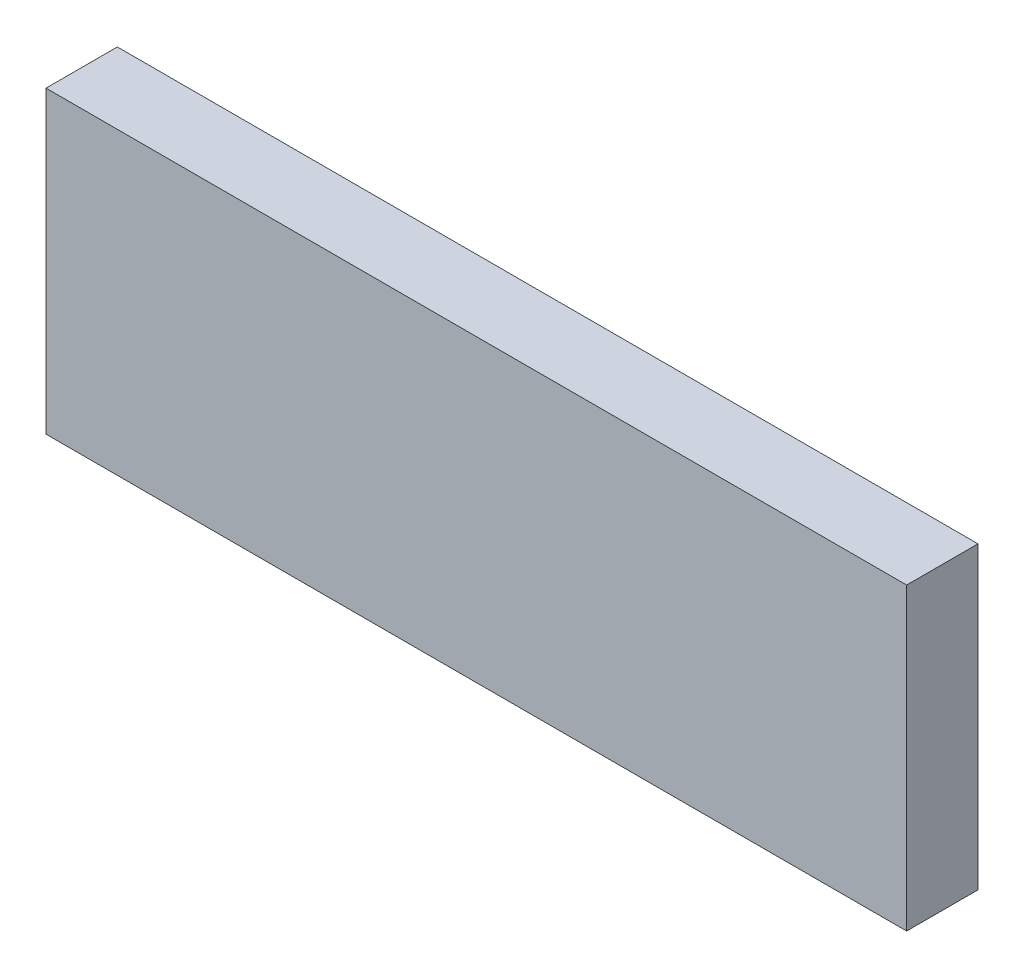
ISO-10303-21;
HEADER;
FILE_DESCRIPTION(('STEP AP214'),'2;1');
FILE_NAME('part.step','',(''),(''),'','','');
FILE_SCHEMA(('AUTOMOTIVE_DESIGN { 1 0 10303 214 1 1 1 1 }'));
ENDSEC;
DATA;
#1=APPLICATION_CONTEXT('core data for automotive mechanical design processes');
#2=APPLICATION_PROTOCOL_DEFINITION('international standard','automotive_design',2000,#1);
#3=PRODUCT_CONTEXT('',#1,'mechanical');
#4=PRODUCT('Part','Part','',(#3));
#5=PRODUCT_RELATED_PRODUCT_CATEGORY('part','',(#4));
#6=PRODUCT_DEFINITION_FORMATION('','',#4);
#7=PRODUCT_DEFINITION_CONTEXT('part definition',#1,'design');
#8=PRODUCT_DEFINITION('design','',#6,#7);
#9=PRODUCT_DEFINITION_SHAPE('','',#8);
#10=(LENGTH_UNIT() NAMED_UNIT(*) SI_UNIT(.MILLI.,.METRE.));
#11=(NAMED_UNIT(*) PLANE_ANGLE_UNIT() SI_UNIT($,.RADIAN.));
#12=(NAMED_UNIT(*) SI_UNIT($,.STERADIAN.) SOLID_ANGLE_UNIT());
#13=UNCERTAINTY_MEASURE_WITH_UNIT(LENGTH_MEASURE(1.E-05),#10,'distance_accuracy_value','');
#14=(GEOMETRIC_REPRESENTATION_CONTEXT(3) GLOBAL_UNCERTAINTY_ASSIGNED_CONTEXT((#13)) GLOBAL_UNIT_ASSIGNED_CONTEXT((#10,
#11,#12)) REPRESENTATION_CONTEXT('',''));
#15=CARTESIAN_POINT('',(0.,0.,0.));
#16=DIRECTION('',(0.,0.,1.));
#17=DIRECTION('',(1.,0.,0.));
#18=AXIS2_PLACEMENT_3D('',#15,#16,#17);
#19=CARTESIAN_POINT('',(-2.4125,0.,0.2));
#20=DIRECTION('',(0.,0.,1.));
#21=DIRECTION('',(1.,0.,0.));
#22=AXIS2_PLACEMENT_3D('',#19,#20,#21);
#23=PLANE('',#22);
#24=DIRECTION('',(0.,1.,0.));
#25=VECTOR('',#24,1.);
#26=CARTESIAN_POINT('',(0.,0.,0.2));
#27=LINE('',#26,#25);
#28=CARTESIAN_POINT('',(0.,0.84,0.2));
#29=VERTEX_POINT('',#28);
#30=CARTESIAN_POINT('',(0.,0.,0.2));
#31=VERTEX_POINT('',#30);
#32=EDGE_CURVE('E76',#29,#31,#27,.F.);
#33=ORIENTED_EDGE('',*,*,#32,.F.);
#34=DIRECTION('',(1.,0.,0.));
#35=VECTOR('',#34,1.);
#36=CARTESIAN_POINT('',(-2.4125,0.84,0.2));
#37=LINE('',#36,#35);
#38=CARTESIAN_POINT('',(-2.4125,0.84,0.2));
#39=VERTEX_POINT('',#38);
#40=EDGE_CURVE('E58',#39,#29,#37,.T.);
#41=ORIENTED_EDGE('',*,*,#40,.F.);
#42=DIRECTION('',(0.,1.,0.));
#43=VECTOR('',#42,1.);
#44=CARTESIAN_POINT('',(-2.4125,0.,0.2));
#45=LINE('',#44,#43);
#46=CARTESIAN_POINT('',(-2.4125,0.,0.2));
#47=VERTEX_POINT('',#46);
#48=EDGE_CURVE('E20',#39,#47,#45,.F.);
#49=ORIENTED_EDGE('',*,*,#48,.T.);
#50=DIRECTION('',(1.,0.,0.));
#51=VECTOR('',#50,1.);
#52=CARTESIAN_POINT('',(-2.4125,0.,0.2));
#53=LINE('',#52,#51);
#54=EDGE_CURVE('E55',#47,#31,#53,.T.);
#55=ORIENTED_EDGE('',*,*,#54,.T.);
#56=EDGE_LOOP('',(#33,#41,#49,#55));
#57=FACE_BOUND('',#56,.T.);
#58=ADVANCED_FACE('F17',(#57),#23,.T.);
#59=CARTESIAN_POINT('',(-2.4125,0.,0.));
#60=DIRECTION('',(1.,0.,0.));
#61=DIRECTION('',(0.,0.,-1.));
#62=AXIS2_PLACEMENT_3D('',#59,#60,#61);
#63=PLANE('',#62);
#64=DIRECTION('',(0.,0.,1.));
#65=VECTOR('',#64,1.);
#66=CARTESIAN_POINT('',(-2.4125,0.84,0.));
#67=LINE('',#66,#65);
#68=CARTESIAN_POINT('',(-2.4125,0.84,0.));
#69=VERTEX_POINT('',#68);
#70=EDGE_CURVE('E78',#69,#39,#67,.T.);
#71=ORIENTED_EDGE('',*,*,#70,.F.);
#72=DIRECTION('',(0.,1.,0.));
#73=VECTOR('',#72,1.);
#74=CARTESIAN_POINT('',(-2.4125,0.,0.));
#75=LINE('',#74,#73);
#76=CARTESIAN_POINT('',(-2.4125,0.,0.));
#77=VERTEX_POINT('',#76);
#78=EDGE_CURVE('E73',#69,#77,#75,.F.);
#79=ORIENTED_EDGE('',*,*,#78,.T.);
#80=DIRECTION('',(0.,0.,1.));
#81=VECTOR('',#80,1.);
#82=CARTESIAN_POINT('',(-2.4125,0.,0.));
#83=LINE('',#82,#81);
#84=EDGE_CURVE('E63',#77,#47,#83,.T.);
#85=ORIENTED_EDGE('',*,*,#84,.T.);
#86=ORIENTED_EDGE('',*,*,#48,.F.);
#87=EDGE_LOOP('',(#71,#79,#85,#86));
#88=FACE_BOUND('',#87,.T.);
#89=ADVANCED_FACE('F72',(#88),#63,.F.);
#90=CARTESIAN_POINT('',(-2.4125,0.,0.));
#91=DIRECTION('',(0.,1.,0.));
#92=DIRECTION('',(0.,0.,1.));
#93=AXIS2_PLACEMENT_3D('',#90,#91,#92);
#94=PLANE('',#93);
#95=ORIENTED_EDGE('',*,*,#54,.F.);
#96=ORIENTED_EDGE('',*,*,#84,.F.);
#97=DIRECTION('',(1.,0.,0.));
#98=VECTOR('',#97,1.);
#99=CARTESIAN_POINT('',(-2.4125,0.,0.));
#100=LINE('',#99,#98);
#101=CARTESIAN_POINT('',(0.,0.,0.));
#102=VERTEX_POINT('',#101);
#103=EDGE_CURVE('E83',#77,#102,#100,.T.);
#104=ORIENTED_EDGE('',*,*,#103,.T.);
#105=DIRECTION('',(0.,0.,-1.));
#106=VECTOR('',#105,1.);
#107=CARTESIAN_POINT('',(0.,0.,0.));
#108=LINE('',#107,#106);
#109=EDGE_CURVE('E69',#31,#102,#108,.T.);
#110=ORIENTED_EDGE('',*,*,#109,.F.);
#111=EDGE_LOOP('',(#95,#96,#104,#110));
#112=FACE_BOUND('',#111,.T.);
#113=ADVANCED_FACE('F66',(#112),#94,.F.);
#114=CARTESIAN_POINT('',(0.,0.,0.));
#115=DIRECTION('',(1.,0.,0.));
#116=DIRECTION('',(0.,0.,-1.));
#117=AXIS2_PLACEMENT_3D('',#114,#115,#116);
#118=PLANE('',#117);
#119=DIRECTION('',(0.,0.,1.));
#120=VECTOR('',#119,1.);
#121=CARTESIAN_POINT('',(0.,0.84,0.));
#122=LINE('',#121,#120);
#123=CARTESIAN_POINT('',(0.,0.84,0.));
#124=VERTEX_POINT('',#123);
#125=EDGE_CURVE('E34',#29,#124,#122,.F.);
#126=ORIENTED_EDGE('',*,*,#125,.F.);
#127=ORIENTED_EDGE('',*,*,#32,.T.);
#128=ORIENTED_EDGE('',*,*,#109,.T.);
#129=DIRECTION('',(0.,1.,0.));
#130=VECTOR('',#129,1.);
#131=CARTESIAN_POINT('',(0.,0.,0.));
#132=LINE('',#131,#130);
#133=EDGE_CURVE('E26',#102,#124,#132,.T.);
#134=ORIENTED_EDGE('',*,*,#133,.T.);
#135=EDGE_LOOP('',(#126,#127,#128,#134));
#136=FACE_BOUND('',#135,.T.);
#137=ADVANCED_FACE('F88',(#136),#118,.T.);
#138=CARTESIAN_POINT('',(-2.4125,0.84,0.));
#139=DIRECTION('',(0.,1.,0.));
#140=DIRECTION('',(0.,0.,1.));
#141=AXIS2_PLACEMENT_3D('',#138,#139,#140);
#142=PLANE('',#141);
#143=ORIENTED_EDGE('',*,*,#40,.T.);
#144=ORIENTED_EDGE('',*,*,#125,.T.);
#145=DIRECTION('',(1.,0.,0.));
#146=VECTOR('',#145,1.);
#147=CARTESIAN_POINT('',(-2.4125,0.84,0.));
#148=LINE('',#147,#146);
#149=EDGE_CURVE('E11',#124,#69,#148,.F.);
#150=ORIENTED_EDGE('',*,*,#149,.T.);
#151=ORIENTED_EDGE('',*,*,#70,.T.);
#152=EDGE_LOOP('',(#143,#144,#150,#151));
#153=FACE_BOUND('',#152,.T.);
#154=ADVANCED_FACE('F91',(#153),#142,.T.);
#155=CARTESIAN_POINT('',(-2.4125,0.,0.));
#156=DIRECTION('',(0.,0.,1.));
#157=DIRECTION('',(1.,0.,0.));
#158=AXIS2_PLACEMENT_3D('',#155,#156,#157);
#159=PLANE('',#158);
#160=ORIENTED_EDGE('',*,*,#133,.F.);
#161=ORIENTED_EDGE('',*,*,#103,.F.);
#162=ORIENTED_EDGE('',*,*,#78,.F.);
#163=ORIENTED_EDGE('',*,*,#149,.F.);
#164=EDGE_LOOP('',(#160,#161,#162,#163));
#165=FACE_BOUND('',#164,.T.);
#166=ADVANCED_FACE('F90',(#165),#159,.F.);
#167=CLOSED_SHELL('',(#58,#89,#113,#137,#154,#166));
#168=MANIFOLD_SOLID_BREP('B1',#167);
#169=ADVANCED_BREP_SHAPE_REPRESENTATION('',(#18,#168),#14);
#170=SHAPE_DEFINITION_REPRESENTATION(#9,#169);
ENDSEC;
END-ISO-10303-21;
